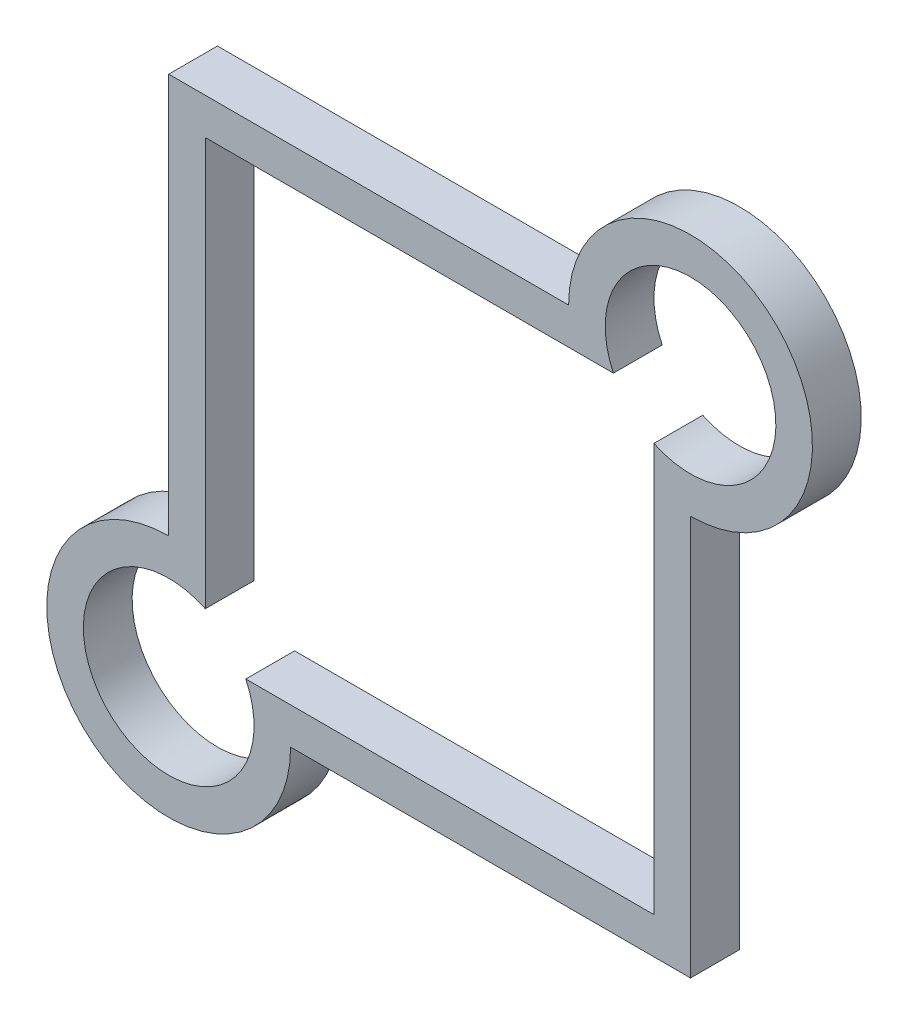
ISO-10303-21;
HEADER;
FILE_DESCRIPTION(('STEP AP214'),'2;1');
FILE_NAME('part.step','',(''),(''),'','','');
FILE_SCHEMA(('AUTOMOTIVE_DESIGN { 1 0 10303 214 1 1 1 1 }'));
ENDSEC;
DATA;
#1=APPLICATION_CONTEXT('core data for automotive mechanical design processes');
#2=APPLICATION_PROTOCOL_DEFINITION('international standard','automotive_design',2000,#1);
#3=PRODUCT_CONTEXT('',#1,'mechanical');
#4=PRODUCT('Part','Part','',(#3));
#5=PRODUCT_RELATED_PRODUCT_CATEGORY('part','',(#4));
#6=PRODUCT_DEFINITION_FORMATION('','',#4);
#7=PRODUCT_DEFINITION_CONTEXT('part definition',#1,'design');
#8=PRODUCT_DEFINITION('design','',#6,#7);
#9=PRODUCT_DEFINITION_SHAPE('','',#8);
#10=(LENGTH_UNIT() NAMED_UNIT(*) SI_UNIT(.MILLI.,.METRE.));
#11=(NAMED_UNIT(*) PLANE_ANGLE_UNIT() SI_UNIT($,.RADIAN.));
#12=(NAMED_UNIT(*) SI_UNIT($,.STERADIAN.) SOLID_ANGLE_UNIT());
#13=UNCERTAINTY_MEASURE_WITH_UNIT(LENGTH_MEASURE(1.E-05),#10,'distance_accuracy_value','');
#14=(GEOMETRIC_REPRESENTATION_CONTEXT(3) GLOBAL_UNCERTAINTY_ASSIGNED_CONTEXT((#13)) GLOBAL_UNIT_ASSIGNED_CONTEXT((#10,
#11,#12)) REPRESENTATION_CONTEXT('',''));
#15=CARTESIAN_POINT('',(0.,0.,0.));
#16=DIRECTION('',(0.,0.,1.));
#17=DIRECTION('',(1.,0.,0.));
#18=AXIS2_PLACEMENT_3D('',#15,#16,#17);
#19=CARTESIAN_POINT('',(0.,0.,20.));
#20=DIRECTION('',(0.,0.,1.));
#21=DIRECTION('',(1.,0.,0.));
#22=AXIS2_PLACEMENT_3D('',#19,#20,#21);
#23=PLANE('',#22);
#24=DIRECTION('',(0.,-1.,0.));
#25=VECTOR('',#24,1.);
#26=CARTESIAN_POINT('',(0.,214.,20.));
#27=LINE('',#26,#25);
#28=CARTESIAN_POINT('',(0.,214.,20.));
#29=VERTEX_POINT('',#28);
#30=CARTESIAN_POINT('',(0.,50.,20.));
#31=VERTEX_POINT('',#30);
#32=EDGE_CURVE('E198',#29,#31,#27,.T.);
#33=ORIENTED_EDGE('',*,*,#32,.T.);
#34=CARTESIAN_POINT('',(0.,0.,20.));
#35=DIRECTION('',(0.,0.,1.));
#36=DIRECTION('',(1.,0.,0.));
#37=AXIS2_PLACEMENT_3D('',#34,#35,#36);
#38=CIRCLE('',#37,50.);
#39=CARTESIAN_POINT('',(50.,0.,20.));
#40=VERTEX_POINT('',#39);
#41=EDGE_CURVE('E202',#31,#40,#38,.T.);
#42=ORIENTED_EDGE('',*,*,#41,.T.);
#43=DIRECTION('',(1.,0.,0.));
#44=VECTOR('',#43,1.);
#45=CARTESIAN_POINT('',(50.,0.,20.));
#46=LINE('',#45,#44);
#47=CARTESIAN_POINT('',(214.,0.,20.));
#48=VERTEX_POINT('',#47);
#49=EDGE_CURVE('E206',#40,#48,#46,.T.);
#50=ORIENTED_EDGE('',*,*,#49,.T.);
#51=DIRECTION('',(0.,1.,0.));
#52=VECTOR('',#51,1.);
#53=CARTESIAN_POINT('',(214.,164.,20.));
#54=LINE('',#53,#52);
#55=CARTESIAN_POINT('',(214.,164.,20.));
#56=VERTEX_POINT('',#55);
#57=EDGE_CURVE('E209',#48,#56,#54,.T.);
#58=ORIENTED_EDGE('',*,*,#57,.T.);
#59=CARTESIAN_POINT('',(214.,214.,20.));
#60=DIRECTION('',(0.,0.,1.));
#61=DIRECTION('',(1.,0.,0.));
#62=AXIS2_PLACEMENT_3D('',#59,#60,#61);
#63=CIRCLE('',#62,50.);
#64=CARTESIAN_POINT('',(164.,214.,20.));
#65=VERTEX_POINT('',#64);
#66=EDGE_CURVE('E212',#56,#65,#63,.T.);
#67=ORIENTED_EDGE('',*,*,#66,.T.);
#68=DIRECTION('',(-1.,0.,0.));
#69=VECTOR('',#68,1.);
#70=CARTESIAN_POINT('',(0.,214.,20.));
#71=LINE('',#70,#69);
#72=EDGE_CURVE('E215',#65,#29,#71,.T.);
#73=ORIENTED_EDGE('',*,*,#72,.T.);
#74=EDGE_LOOP('',(#33,#42,#50,#58,#67,#73));
#75=FACE_BOUND('',#74,.T.);
#76=DIRECTION('',(1.,0.,0.));
#77=VECTOR('',#76,1.);
#78=CARTESIAN_POINT('',(31.6227766016838,15.,20.));
#79=LINE('',#78,#77);
#80=CARTESIAN_POINT('',(31.6227766016838,15.,20.));
#81=VERTEX_POINT('',#80);
#82=CARTESIAN_POINT('',(199.,15.,20.));
#83=VERTEX_POINT('',#82);
#84=EDGE_CURVE('E138',#81,#83,#79,.T.);
#85=ORIENTED_EDGE('',*,*,#84,.F.);
#86=CARTESIAN_POINT('',(0.,0.,20.));
#87=DIRECTION('',(0.,0.,1.));
#88=DIRECTION('',(1.,0.,0.));
#89=AXIS2_PLACEMENT_3D('',#86,#87,#88);
#90=CIRCLE('',#89,35.);
#91=CARTESIAN_POINT('',(15.,31.6227766016838,20.));
#92=VERTEX_POINT('',#91);
#93=EDGE_CURVE('E129',#92,#81,#90,.T.);
#94=ORIENTED_EDGE('',*,*,#93,.F.);
#95=DIRECTION('',(0.,-1.,0.));
#96=VECTOR('',#95,1.);
#97=CARTESIAN_POINT('',(15.,31.6227766016838,20.));
#98=LINE('',#97,#96);
#99=CARTESIAN_POINT('',(15.,199.,20.));
#100=VERTEX_POINT('',#99);
#101=EDGE_CURVE('E164',#100,#92,#98,.T.);
#102=ORIENTED_EDGE('',*,*,#101,.F.);
#103=DIRECTION('',(-1.,0.,0.));
#104=VECTOR('',#103,1.);
#105=CARTESIAN_POINT('',(15.,199.,20.));
#106=LINE('',#105,#104);
#107=CARTESIAN_POINT('',(182.377223398316,199.,20.));
#108=VERTEX_POINT('',#107);
#109=EDGE_CURVE('E161',#108,#100,#106,.T.);
#110=ORIENTED_EDGE('',*,*,#109,.F.);
#111=CARTESIAN_POINT('',(214.,214.,20.));
#112=DIRECTION('',(0.,0.,1.));
#113=DIRECTION('',(1.,0.,0.));
#114=AXIS2_PLACEMENT_3D('',#111,#112,#113);
#115=CIRCLE('',#114,35.);
#116=CARTESIAN_POINT('',(199.,182.377223398316,20.));
#117=VERTEX_POINT('',#116);
#118=EDGE_CURVE('E156',#117,#108,#115,.T.);
#119=ORIENTED_EDGE('',*,*,#118,.F.);
#120=DIRECTION('',(0.,1.,0.));
#121=VECTOR('',#120,1.);
#122=CARTESIAN_POINT('',(199.,15.,20.));
#123=LINE('',#122,#121);
#124=EDGE_CURVE('E152',#83,#117,#123,.T.);
#125=ORIENTED_EDGE('',*,*,#124,.F.);
#126=EDGE_LOOP('',(#85,#94,#102,#110,#119,#125));
#127=FACE_BOUND('',#126,.T.);
#128=ADVANCED_FACE('F39',(#75,#127),#23,.T.);
#129=CARTESIAN_POINT('',(0.,0.,0.));
#130=DIRECTION('',(0.,0.,1.));
#131=DIRECTION('',(1.,0.,0.));
#132=AXIS2_PLACEMENT_3D('',#129,#130,#131);
#133=PLANE('',#132);
#134=DIRECTION('',(0.,-1.,0.));
#135=VECTOR('',#134,1.);
#136=CARTESIAN_POINT('',(0.,214.,0.));
#137=LINE('',#136,#135);
#138=CARTESIAN_POINT('',(0.,214.,0.));
#139=VERTEX_POINT('',#138);
#140=CARTESIAN_POINT('',(0.,50.,0.));
#141=VERTEX_POINT('',#140);
#142=EDGE_CURVE('E147',#139,#141,#137,.T.);
#143=ORIENTED_EDGE('',*,*,#142,.F.);
#144=DIRECTION('',(-1.,0.,0.));
#145=VECTOR('',#144,1.);
#146=CARTESIAN_POINT('',(0.,214.,0.));
#147=LINE('',#146,#145);
#148=CARTESIAN_POINT('',(164.,214.,0.));
#149=VERTEX_POINT('',#148);
#150=EDGE_CURVE('E203',#149,#139,#147,.T.);
#151=ORIENTED_EDGE('',*,*,#150,.F.);
#152=CARTESIAN_POINT('',(214.,214.,0.));
#153=DIRECTION('',(0.,0.,1.));
#154=DIRECTION('',(1.,0.,0.));
#155=AXIS2_PLACEMENT_3D('',#152,#153,#154);
#156=CIRCLE('',#155,50.);
#157=CARTESIAN_POINT('',(214.,164.,0.));
#158=VERTEX_POINT('',#157);
#159=EDGE_CURVE('E231',#158,#149,#156,.T.);
#160=ORIENTED_EDGE('',*,*,#159,.F.);
#161=DIRECTION('',(0.,1.,0.));
#162=VECTOR('',#161,1.);
#163=CARTESIAN_POINT('',(214.,164.,0.));
#164=LINE('',#163,#162);
#165=CARTESIAN_POINT('',(214.,0.,0.));
#166=VERTEX_POINT('',#165);
#167=EDGE_CURVE('E228',#166,#158,#164,.T.);
#168=ORIENTED_EDGE('',*,*,#167,.F.);
#169=DIRECTION('',(1.,0.,0.));
#170=VECTOR('',#169,1.);
#171=CARTESIAN_POINT('',(50.,0.,0.));
#172=LINE('',#171,#170);
#173=CARTESIAN_POINT('',(50.,0.,0.));
#174=VERTEX_POINT('',#173);
#175=EDGE_CURVE('E225',#174,#166,#172,.T.);
#176=ORIENTED_EDGE('',*,*,#175,.F.);
#177=CARTESIAN_POINT('',(0.,0.,0.));
#178=DIRECTION('',(0.,0.,1.));
#179=DIRECTION('',(1.,0.,0.));
#180=AXIS2_PLACEMENT_3D('',#177,#178,#179);
#181=CIRCLE('',#180,50.);
#182=EDGE_CURVE('E222',#141,#174,#181,.T.);
#183=ORIENTED_EDGE('',*,*,#182,.F.);
#184=EDGE_LOOP('',(#143,#151,#160,#168,#176,#183));
#185=FACE_BOUND('',#184,.T.);
#186=CARTESIAN_POINT('',(0.,0.,0.));
#187=DIRECTION('',(0.,0.,1.));
#188=DIRECTION('',(1.,0.,0.));
#189=AXIS2_PLACEMENT_3D('',#186,#187,#188);
#190=CIRCLE('',#189,35.);
#191=CARTESIAN_POINT('',(15.,31.6227766016838,0.));
#192=VERTEX_POINT('',#191);
#193=CARTESIAN_POINT('',(31.6227766016838,15.,0.));
#194=VERTEX_POINT('',#193);
#195=EDGE_CURVE('E63',#192,#194,#190,.T.);
#196=ORIENTED_EDGE('',*,*,#195,.T.);
#197=DIRECTION('',(1.,0.,0.));
#198=VECTOR('',#197,1.);
#199=CARTESIAN_POINT('',(31.6227766016838,15.,0.));
#200=LINE('',#199,#198);
#201=CARTESIAN_POINT('',(199.,15.,0.));
#202=VERTEX_POINT('',#201);
#203=EDGE_CURVE('E145',#194,#202,#200,.T.);
#204=ORIENTED_EDGE('',*,*,#203,.T.);
#205=DIRECTION('',(0.,1.,0.));
#206=VECTOR('',#205,1.);
#207=CARTESIAN_POINT('',(199.,15.,0.));
#208=LINE('',#207,#206);
#209=CARTESIAN_POINT('',(199.,182.377223398316,0.));
#210=VERTEX_POINT('',#209);
#211=EDGE_CURVE('E171',#202,#210,#208,.T.);
#212=ORIENTED_EDGE('',*,*,#211,.T.);
#213=CARTESIAN_POINT('',(214.,214.,0.));
#214=DIRECTION('',(0.,0.,1.));
#215=DIRECTION('',(1.,0.,0.));
#216=AXIS2_PLACEMENT_3D('',#213,#214,#215);
#217=CIRCLE('',#216,35.);
#218=CARTESIAN_POINT('',(182.377223398316,199.,0.));
#219=VERTEX_POINT('',#218);
#220=EDGE_CURVE('E175',#210,#219,#217,.T.);
#221=ORIENTED_EDGE('',*,*,#220,.T.);
#222=DIRECTION('',(-1.,0.,0.));
#223=VECTOR('',#222,1.);
#224=CARTESIAN_POINT('',(15.,199.,0.));
#225=LINE('',#224,#223);
#226=CARTESIAN_POINT('',(15.,199.,0.));
#227=VERTEX_POINT('',#226);
#228=EDGE_CURVE('E179',#219,#227,#225,.T.);
#229=ORIENTED_EDGE('',*,*,#228,.T.);
#230=DIRECTION('',(0.,-1.,0.));
#231=VECTOR('',#230,1.);
#232=CARTESIAN_POINT('',(15.,31.6227766016838,0.));
#233=LINE('',#232,#231);
#234=EDGE_CURVE('E139',#227,#192,#233,.T.);
#235=ORIENTED_EDGE('',*,*,#234,.T.);
#236=EDGE_LOOP('',(#196,#204,#212,#221,#229,#235));
#237=FACE_BOUND('',#236,.T.);
#238=ADVANCED_FACE('F262',(#185,#237),#133,.F.);
#239=CARTESIAN_POINT('',(0.,214.,20.));
#240=DIRECTION('',(1.,0.,0.));
#241=DIRECTION('',(0.,1.,0.));
#242=AXIS2_PLACEMENT_3D('',#239,#240,#241);
#243=PLANE('',#242);
#244=ORIENTED_EDGE('',*,*,#142,.T.);
#245=DIRECTION('',(0.,0.,-1.));
#246=VECTOR('',#245,1.);
#247=CARTESIAN_POINT('',(0.,50.,20.));
#248=LINE('',#247,#246);
#249=EDGE_CURVE('E11',#31,#141,#248,.T.);
#250=ORIENTED_EDGE('',*,*,#249,.F.);
#251=ORIENTED_EDGE('',*,*,#32,.F.);
#252=DIRECTION('',(0.,0.,-1.));
#253=VECTOR('',#252,1.);
#254=CARTESIAN_POINT('',(0.,214.,20.));
#255=LINE('',#254,#253);
#256=EDGE_CURVE('E218',#29,#139,#255,.T.);
#257=ORIENTED_EDGE('',*,*,#256,.T.);
#258=EDGE_LOOP('',(#244,#250,#251,#257));
#259=FACE_BOUND('',#258,.T.);
#260=ADVANCED_FACE('F41',(#259),#243,.F.);
#261=CARTESIAN_POINT('',(0.,0.,20.));
#262=DIRECTION('',(0.,0.,-1.));
#263=DIRECTION('',(-1.,0.,0.));
#264=AXIS2_PLACEMENT_3D('',#261,#262,#263);
#265=CYLINDRICAL_SURFACE('',#264,50.);
#266=ORIENTED_EDGE('',*,*,#182,.T.);
#267=DIRECTION('',(0.,0.,-1.));
#268=VECTOR('',#267,1.);
#269=CARTESIAN_POINT('',(50.,0.,20.));
#270=LINE('',#269,#268);
#271=EDGE_CURVE('E48',#40,#174,#270,.T.);
#272=ORIENTED_EDGE('',*,*,#271,.F.);
#273=ORIENTED_EDGE('',*,*,#41,.F.);
#274=ORIENTED_EDGE('',*,*,#249,.T.);
#275=EDGE_LOOP('',(#266,#272,#273,#274));
#276=FACE_BOUND('',#275,.T.);
#277=ADVANCED_FACE('F279',(#276),#265,.T.);
#278=CARTESIAN_POINT('',(50.,0.,20.));
#279=DIRECTION('',(0.,1.,0.));
#280=DIRECTION('',(0.,0.,1.));
#281=AXIS2_PLACEMENT_3D('',#278,#279,#280);
#282=PLANE('',#281);
#283=ORIENTED_EDGE('',*,*,#175,.T.);
#284=DIRECTION('',(0.,0.,-1.));
#285=VECTOR('',#284,1.);
#286=CARTESIAN_POINT('',(214.,0.,20.));
#287=LINE('',#286,#285);
#288=EDGE_CURVE('E247',#48,#166,#287,.T.);
#289=ORIENTED_EDGE('',*,*,#288,.F.);
#290=ORIENTED_EDGE('',*,*,#49,.F.);
#291=ORIENTED_EDGE('',*,*,#271,.T.);
#292=EDGE_LOOP('',(#283,#289,#290,#291));
#293=FACE_BOUND('',#292,.T.);
#294=ADVANCED_FACE('F256',(#293),#282,.F.);
#295=CARTESIAN_POINT('',(214.,164.,20.));
#296=DIRECTION('',(-1.,0.,0.));
#297=DIRECTION('',(0.,0.,1.));
#298=AXIS2_PLACEMENT_3D('',#295,#296,#297);
#299=PLANE('',#298);
#300=ORIENTED_EDGE('',*,*,#167,.T.);
#301=DIRECTION('',(0.,0.,-1.));
#302=VECTOR('',#301,1.);
#303=CARTESIAN_POINT('',(214.,164.,20.));
#304=LINE('',#303,#302);
#305=EDGE_CURVE('E243',#56,#158,#304,.T.);
#306=ORIENTED_EDGE('',*,*,#305,.F.);
#307=ORIENTED_EDGE('',*,*,#57,.F.);
#308=ORIENTED_EDGE('',*,*,#288,.T.);
#309=EDGE_LOOP('',(#300,#306,#307,#308));
#310=FACE_BOUND('',#309,.T.);
#311=ADVANCED_FACE('F268',(#310),#299,.F.);
#312=CARTESIAN_POINT('',(214.,214.,20.));
#313=DIRECTION('',(0.,0.,-1.));
#314=DIRECTION('',(-1.,0.,0.));
#315=AXIS2_PLACEMENT_3D('',#312,#313,#314);
#316=CYLINDRICAL_SURFACE('',#315,50.);
#317=ORIENTED_EDGE('',*,*,#159,.T.);
#318=DIRECTION('',(0.,0.,-1.));
#319=VECTOR('',#318,1.);
#320=CARTESIAN_POINT('',(164.,214.,20.));
#321=LINE('',#320,#319);
#322=EDGE_CURVE('E239',#65,#149,#321,.T.);
#323=ORIENTED_EDGE('',*,*,#322,.F.);
#324=ORIENTED_EDGE('',*,*,#66,.F.);
#325=ORIENTED_EDGE('',*,*,#305,.T.);
#326=EDGE_LOOP('',(#317,#323,#324,#325));
#327=FACE_BOUND('',#326,.T.);
#328=ADVANCED_FACE('F272',(#327),#316,.T.);
#329=CARTESIAN_POINT('',(0.,214.,20.));
#330=DIRECTION('',(0.,-1.,0.));
#331=DIRECTION('',(0.,0.,-1.));
#332=AXIS2_PLACEMENT_3D('',#329,#330,#331);
#333=PLANE('',#332);
#334=ORIENTED_EDGE('',*,*,#150,.T.);
#335=ORIENTED_EDGE('',*,*,#256,.F.);
#336=ORIENTED_EDGE('',*,*,#72,.F.);
#337=ORIENTED_EDGE('',*,*,#322,.T.);
#338=EDGE_LOOP('',(#334,#335,#336,#337));
#339=FACE_BOUND('',#338,.T.);
#340=ADVANCED_FACE('F282',(#339),#333,.F.);
#341=CARTESIAN_POINT('',(0.,0.,20.));
#342=DIRECTION('',(0.,0.,-1.));
#343=DIRECTION('',(-1.,0.,0.));
#344=AXIS2_PLACEMENT_3D('',#341,#342,#343);
#345=CYLINDRICAL_SURFACE('',#344,35.);
#346=ORIENTED_EDGE('',*,*,#195,.F.);
#347=DIRECTION('',(0.,0.,-1.));
#348=VECTOR('',#347,1.);
#349=CARTESIAN_POINT('',(15.,31.6227766016838,20.));
#350=LINE('',#349,#348);
#351=EDGE_CURVE('E133',#92,#192,#350,.T.);
#352=ORIENTED_EDGE('',*,*,#351,.F.);
#353=ORIENTED_EDGE('',*,*,#93,.T.);
#354=DIRECTION('',(0.,0.,-1.));
#355=VECTOR('',#354,1.);
#356=CARTESIAN_POINT('',(31.6227766016838,15.,20.));
#357=LINE('',#356,#355);
#358=EDGE_CURVE('E132',#81,#194,#357,.T.);
#359=ORIENTED_EDGE('',*,*,#358,.T.);
#360=EDGE_LOOP('',(#346,#352,#353,#359));
#361=FACE_BOUND('',#360,.T.);
#362=ADVANCED_FACE('F131',(#361),#345,.F.);
#363=CARTESIAN_POINT('',(31.6227766016838,15.,20.));
#364=DIRECTION('',(0.,1.,0.));
#365=DIRECTION('',(0.,0.,1.));
#366=AXIS2_PLACEMENT_3D('',#363,#364,#365);
#367=PLANE('',#366);
#368=ORIENTED_EDGE('',*,*,#203,.F.);
#369=ORIENTED_EDGE('',*,*,#358,.F.);
#370=ORIENTED_EDGE('',*,*,#84,.T.);
#371=DIRECTION('',(0.,0.,-1.));
#372=VECTOR('',#371,1.);
#373=CARTESIAN_POINT('',(199.,15.,20.));
#374=LINE('',#373,#372);
#375=EDGE_CURVE('E148',#83,#202,#374,.T.);
#376=ORIENTED_EDGE('',*,*,#375,.T.);
#377=EDGE_LOOP('',(#368,#369,#370,#376));
#378=FACE_BOUND('',#377,.T.);
#379=ADVANCED_FACE('F142',(#378),#367,.T.);
#380=CARTESIAN_POINT('',(199.,15.,20.));
#381=DIRECTION('',(-1.,0.,0.));
#382=DIRECTION('',(0.,0.,1.));
#383=AXIS2_PLACEMENT_3D('',#380,#381,#382);
#384=PLANE('',#383);
#385=ORIENTED_EDGE('',*,*,#211,.F.);
#386=ORIENTED_EDGE('',*,*,#375,.F.);
#387=ORIENTED_EDGE('',*,*,#124,.T.);
#388=DIRECTION('',(0.,0.,-1.));
#389=VECTOR('',#388,1.);
#390=CARTESIAN_POINT('',(199.,182.377223398316,20.));
#391=LINE('',#390,#389);
#392=EDGE_CURVE('E193',#117,#210,#391,.T.);
#393=ORIENTED_EDGE('',*,*,#392,.T.);
#394=EDGE_LOOP('',(#385,#386,#387,#393));
#395=FACE_BOUND('',#394,.T.);
#396=ADVANCED_FACE('F300',(#395),#384,.T.);
#397=CARTESIAN_POINT('',(214.,214.,20.));
#398=DIRECTION('',(0.,0.,-1.));
#399=DIRECTION('',(-1.,0.,0.));
#400=AXIS2_PLACEMENT_3D('',#397,#398,#399);
#401=CYLINDRICAL_SURFACE('',#400,35.);
#402=ORIENTED_EDGE('',*,*,#220,.F.);
#403=ORIENTED_EDGE('',*,*,#392,.F.);
#404=ORIENTED_EDGE('',*,*,#118,.T.);
#405=DIRECTION('',(0.,0.,-1.));
#406=VECTOR('',#405,1.);
#407=CARTESIAN_POINT('',(182.377223398316,199.,20.));
#408=LINE('',#407,#406);
#409=EDGE_CURVE('E190',#108,#219,#408,.T.);
#410=ORIENTED_EDGE('',*,*,#409,.T.);
#411=EDGE_LOOP('',(#402,#403,#404,#410));
#412=FACE_BOUND('',#411,.T.);
#413=ADVANCED_FACE('F303',(#412),#401,.F.);
#414=CARTESIAN_POINT('',(15.,199.,20.));
#415=DIRECTION('',(0.,-1.,0.));
#416=DIRECTION('',(0.,0.,-1.));
#417=AXIS2_PLACEMENT_3D('',#414,#415,#416);
#418=PLANE('',#417);
#419=ORIENTED_EDGE('',*,*,#228,.F.);
#420=ORIENTED_EDGE('',*,*,#409,.F.);
#421=ORIENTED_EDGE('',*,*,#109,.T.);
#422=DIRECTION('',(0.,0.,-1.));
#423=VECTOR('',#422,1.);
#424=CARTESIAN_POINT('',(15.,199.,20.));
#425=LINE('',#424,#423);
#426=EDGE_CURVE('E55',#100,#227,#425,.T.);
#427=ORIENTED_EDGE('',*,*,#426,.T.);
#428=EDGE_LOOP('',(#419,#420,#421,#427));
#429=FACE_BOUND('',#428,.T.);
#430=ADVANCED_FACE('F307',(#429),#418,.T.);
#431=CARTESIAN_POINT('',(15.,31.6227766016838,20.));
#432=DIRECTION('',(1.,0.,0.));
#433=DIRECTION('',(0.,0.,-1.));
#434=AXIS2_PLACEMENT_3D('',#431,#432,#433);
#435=PLANE('',#434);
#436=ORIENTED_EDGE('',*,*,#234,.F.);
#437=ORIENTED_EDGE('',*,*,#426,.F.);
#438=ORIENTED_EDGE('',*,*,#101,.T.);
#439=ORIENTED_EDGE('',*,*,#351,.T.);
#440=EDGE_LOOP('',(#436,#437,#438,#439));
#441=FACE_BOUND('',#440,.T.);
#442=ADVANCED_FACE('F311',(#441),#435,.T.);
#443=CLOSED_SHELL('',(#128,#238,#260,#277,#294,#311,#328,#340,#362,#379,#396,#413,#430,#442));
#444=MANIFOLD_SOLID_BREP('B2',#443);
#445=ADVANCED_BREP_SHAPE_REPRESENTATION('',(#18,#444),#14);
#446=SHAPE_DEFINITION_REPRESENTATION(#9,#445);
ENDSEC;
END-ISO-10303-21;
